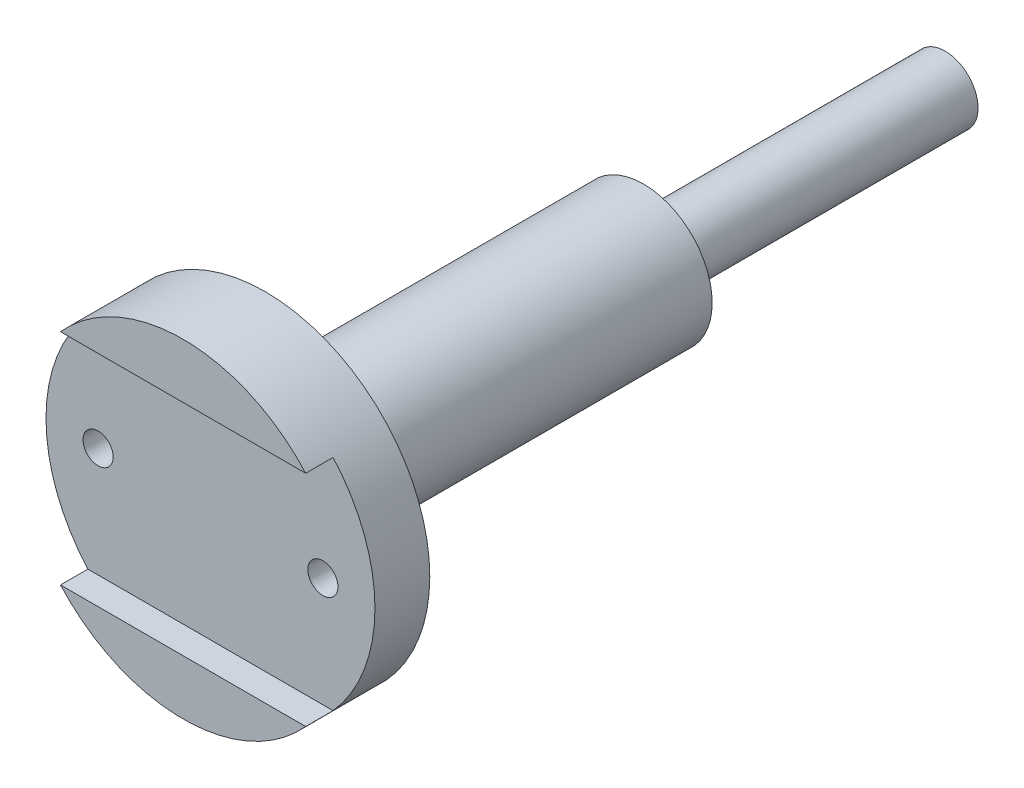
ISO-10303-21;
HEADER;
FILE_DESCRIPTION(('STEP AP214'),'2;1');
FILE_NAME('part.step','',(''),(''),'','','');
FILE_SCHEMA(('AUTOMOTIVE_DESIGN { 1 0 10303 214 1 1 1 1 }'));
ENDSEC;
DATA;
#1=APPLICATION_CONTEXT('core data for automotive mechanical design processes');
#2=APPLICATION_PROTOCOL_DEFINITION('international standard','automotive_design',2000,#1);
#3=PRODUCT_CONTEXT('',#1,'mechanical');
#4=PRODUCT('Part','Part','',(#3));
#5=PRODUCT_RELATED_PRODUCT_CATEGORY('part','',(#4));
#6=PRODUCT_DEFINITION_FORMATION('','',#4);
#7=PRODUCT_DEFINITION_CONTEXT('part definition',#1,'design');
#8=PRODUCT_DEFINITION('design','',#6,#7);
#9=PRODUCT_DEFINITION_SHAPE('','',#8);
#10=(LENGTH_UNIT() NAMED_UNIT(*) SI_UNIT(.MILLI.,.METRE.));
#11=(NAMED_UNIT(*) PLANE_ANGLE_UNIT() SI_UNIT($,.RADIAN.));
#12=(NAMED_UNIT(*) SI_UNIT($,.STERADIAN.) SOLID_ANGLE_UNIT());
#13=UNCERTAINTY_MEASURE_WITH_UNIT(LENGTH_MEASURE(1.E-05),#10,'distance_accuracy_value','');
#14=(GEOMETRIC_REPRESENTATION_CONTEXT(3) GLOBAL_UNCERTAINTY_ASSIGNED_CONTEXT((#13)) GLOBAL_UNIT_ASSIGNED_CONTEXT((#10,
#11,#12)) REPRESENTATION_CONTEXT('',''));
#15=CARTESIAN_POINT('',(0.,0.,0.));
#16=DIRECTION('',(0.,0.,1.));
#17=DIRECTION('',(1.,0.,0.));
#18=AXIS2_PLACEMENT_3D('',#15,#16,#17);
#19=CARTESIAN_POINT('',(0.,0.,0.));
#20=DIRECTION('',(0.,0.,1.));
#21=DIRECTION('',(1.,0.,0.));
#22=AXIS2_PLACEMENT_3D('',#19,#20,#21);
#23=PLANE('',#22);
#24=CARTESIAN_POINT('',(20.5,0.,0.));
#25=DIRECTION('',(0.,0.,-1.));
#26=DIRECTION('',(-1.,0.,0.));
#27=AXIS2_PLACEMENT_3D('',#24,#25,#26);
#28=CIRCLE('',#27,6.12);
#29=CARTESIAN_POINT('',(14.38,0.,0.));
#30=VERTEX_POINT('',#29);
#31=EDGE_CURVE('E166',#30,#30,#28,.T.);
#32=ORIENTED_EDGE('',*,*,#31,.F.);
#33=EDGE_LOOP('',(#32));
#34=FACE_BOUND('',#33,.T.);
#35=CARTESIAN_POINT('',(0.,0.,0.));
#36=DIRECTION('',(0.,0.,1.));
#37=DIRECTION('',(1.,0.,0.));
#38=AXIS2_PLACEMENT_3D('',#35,#36,#37);
#39=CIRCLE('',#38,12.5);
#40=CARTESIAN_POINT('',(12.5,0.,0.));
#41=VERTEX_POINT('',#40);
#42=EDGE_CURVE('E86',#41,#41,#39,.F.);
#43=ORIENTED_EDGE('',*,*,#42,.F.);
#44=EDGE_LOOP('',(#43));
#45=FACE_BOUND('',#44,.T.);
#46=CARTESIAN_POINT('',(0.,0.,0.));
#47=DIRECTION('',(0.,0.,1.));
#48=DIRECTION('',(1.,0.,0.));
#49=AXIS2_PLACEMENT_3D('',#46,#47,#48);
#50=CIRCLE('',#49,30.);
#51=CARTESIAN_POINT('',(30.,0.,0.));
#52=VERTEX_POINT('',#51);
#53=EDGE_CURVE('E97',#52,#52,#50,.T.);
#54=ORIENTED_EDGE('',*,*,#53,.F.);
#55=EDGE_LOOP('',(#54));
#56=FACE_BOUND('',#55,.T.);
#57=CARTESIAN_POINT('',(-20.5,0.,0.));
#58=DIRECTION('',(0.,0.,-1.));
#59=DIRECTION('',(-1.,0.,0.));
#60=AXIS2_PLACEMENT_3D('',#57,#58,#59);
#61=CIRCLE('',#60,6.12);
#62=CARTESIAN_POINT('',(-26.62,0.,0.));
#63=VERTEX_POINT('',#62);
#64=EDGE_CURVE('E148',#63,#63,#61,.T.);
#65=ORIENTED_EDGE('',*,*,#64,.F.);
#66=EDGE_LOOP('',(#65));
#67=FACE_BOUND('',#66,.T.);
#68=ADVANCED_FACE('F35',(#34,#45,#56,#67),#23,.F.);
#69=CARTESIAN_POINT('',(0.,0.,15.));
#70=DIRECTION('',(0.,0.,1.));
#71=DIRECTION('',(1.,0.,0.));
#72=AXIS2_PLACEMENT_3D('',#69,#70,#71);
#73=PLANE('',#72);
#74=DIRECTION('',(-1.,0.,0.));
#75=VECTOR('',#74,1.);
#76=CARTESIAN_POINT('',(0.,20.,15.));
#77=LINE('',#76,#75);
#78=CARTESIAN_POINT('',(22.3606797749979,20.,15.));
#79=VERTEX_POINT('',#78);
#80=CARTESIAN_POINT('',(-22.3606797749979,20.,15.));
#81=VERTEX_POINT('',#80);
#82=EDGE_CURVE('E85',#79,#81,#77,.T.);
#83=ORIENTED_EDGE('',*,*,#82,.F.);
#84=CARTESIAN_POINT('',(0.,0.,15.));
#85=DIRECTION('',(0.,0.,1.));
#86=DIRECTION('',(1.,0.,0.));
#87=AXIS2_PLACEMENT_3D('',#84,#85,#86);
#88=CIRCLE('',#87,30.);
#89=EDGE_CURVE('E96',#79,#81,#88,.T.);
#90=ORIENTED_EDGE('',*,*,#89,.T.);
#91=EDGE_LOOP('',(#83,#90));
#92=FACE_BOUND('',#91,.T.);
#93=ADVANCED_FACE('F142',(#92),#73,.T.);
#94=CARTESIAN_POINT('',(0.,0.,15.));
#95=DIRECTION('',(0.,0.,-1.));
#96=DIRECTION('',(-1.,0.,0.));
#97=AXIS2_PLACEMENT_3D('',#94,#95,#96);
#98=CYLINDRICAL_SURFACE('',#97,30.);
#99=ORIENTED_EDGE('',*,*,#89,.F.);
#100=DIRECTION('',(0.,0.,-1.));
#101=VECTOR('',#100,1.);
#102=CARTESIAN_POINT('',(22.3606797749979,20.,15.));
#103=LINE('',#102,#101);
#104=CARTESIAN_POINT('',(22.3606797749979,20.,10.));
#105=VERTEX_POINT('',#104);
#106=EDGE_CURVE('E128',#79,#105,#103,.T.);
#107=ORIENTED_EDGE('',*,*,#106,.T.);
#108=CARTESIAN_POINT('',(0.,0.,10.));
#109=DIRECTION('',(0.,0.,-1.));
#110=DIRECTION('',(-1.,0.,0.));
#111=AXIS2_PLACEMENT_3D('',#108,#109,#110);
#112=CIRCLE('',#111,30.);
#113=CARTESIAN_POINT('',(22.3606797749979,-20.,10.));
#114=VERTEX_POINT('',#113);
#115=EDGE_CURVE('E11',#105,#114,#112,.T.);
#116=ORIENTED_EDGE('',*,*,#115,.T.);
#117=DIRECTION('',(0.,0.,-1.));
#118=VECTOR('',#117,1.);
#119=CARTESIAN_POINT('',(22.3606797749979,-20.,15.));
#120=LINE('',#119,#118);
#121=CARTESIAN_POINT('',(22.3606797749979,-20.,15.));
#122=VERTEX_POINT('',#121);
#123=EDGE_CURVE('E80',#114,#122,#120,.F.);
#124=ORIENTED_EDGE('',*,*,#123,.T.);
#125=CARTESIAN_POINT('',(-22.3606797749979,-20.,15.));
#126=VERTEX_POINT('',#125);
#127=EDGE_CURVE('E91',#126,#122,#88,.T.);
#128=ORIENTED_EDGE('',*,*,#127,.F.);
#129=DIRECTION('',(0.,0.,-1.));
#130=VECTOR('',#129,1.);
#131=CARTESIAN_POINT('',(-22.3606797749979,-20.,15.));
#132=LINE('',#131,#130);
#133=CARTESIAN_POINT('',(-22.3606797749979,-20.,10.));
#134=VERTEX_POINT('',#133);
#135=EDGE_CURVE('E52',#126,#134,#132,.T.);
#136=ORIENTED_EDGE('',*,*,#135,.T.);
#137=CARTESIAN_POINT('',(-22.3606797749979,20.,10.));
#138=VERTEX_POINT('',#137);
#139=EDGE_CURVE('E44',#134,#138,#112,.T.);
#140=ORIENTED_EDGE('',*,*,#139,.T.);
#141=DIRECTION('',(0.,0.,-1.));
#142=VECTOR('',#141,1.);
#143=CARTESIAN_POINT('',(-22.3606797749979,20.,15.));
#144=LINE('',#143,#142);
#145=EDGE_CURVE('E60',#138,#81,#144,.F.);
#146=ORIENTED_EDGE('',*,*,#145,.T.);
#147=EDGE_LOOP('',(#99,#107,#116,#124,#128,#136,#140,#146));
#148=FACE_BOUND('',#147,.T.);
#149=ORIENTED_EDGE('',*,*,#53,.T.);
#150=EDGE_LOOP('',(#149));
#151=FACE_BOUND('',#150,.T.);
#152=ADVANCED_FACE('F37',(#148,#151),#98,.T.);
#153=DIRECTION('',(1.,0.,0.));
#154=VECTOR('',#153,1.);
#155=CARTESIAN_POINT('',(0.,-20.,15.));
#156=LINE('',#155,#154);
#157=EDGE_CURVE('E77',#126,#122,#156,.T.);
#158=ORIENTED_EDGE('',*,*,#157,.F.);
#159=ORIENTED_EDGE('',*,*,#127,.T.);
#160=EDGE_LOOP('',(#158,#159));
#161=FACE_BOUND('',#160,.T.);
#162=ADVANCED_FACE('F95',(#161),#73,.T.);
#163=CARTESIAN_POINT('',(0.,0.,-69.));
#164=DIRECTION('',(0.,0.,1.));
#165=DIRECTION('',(1.,0.,0.));
#166=AXIS2_PLACEMENT_3D('',#163,#164,#165);
#167=CYLINDRICAL_SURFACE('',#166,12.5);
#168=CARTESIAN_POINT('',(0.,0.,-69.));
#169=DIRECTION('',(0.,0.,-1.));
#170=DIRECTION('',(-1.,0.,0.));
#171=AXIS2_PLACEMENT_3D('',#168,#169,#170);
#172=CIRCLE('',#171,12.5);
#173=CARTESIAN_POINT('',(-12.5,0.,-69.));
#174=VERTEX_POINT('',#173);
#175=EDGE_CURVE('E101',#174,#174,#172,.T.);
#176=ORIENTED_EDGE('',*,*,#175,.F.);
#177=EDGE_LOOP('',(#176));
#178=FACE_BOUND('',#177,.T.);
#179=ORIENTED_EDGE('',*,*,#42,.T.);
#180=EDGE_LOOP('',(#179));
#181=FACE_BOUND('',#180,.T.);
#182=ADVANCED_FACE('F134',(#178,#181),#167,.T.);
#183=CARTESIAN_POINT('',(0.,0.,-69.));
#184=DIRECTION('',(0.,0.,-1.));
#185=DIRECTION('',(-1.,0.,0.));
#186=AXIS2_PLACEMENT_3D('',#183,#184,#185);
#187=PLANE('',#186);
#188=CARTESIAN_POINT('',(0.,0.,-69.));
#189=DIRECTION('',(0.,0.,-1.));
#190=DIRECTION('',(-1.,0.,0.));
#191=AXIS2_PLACEMENT_3D('',#188,#189,#190);
#192=CIRCLE('',#191,6.);
#193=CARTESIAN_POINT('',(-6.,0.,-69.));
#194=VERTEX_POINT('',#193);
#195=EDGE_CURVE('E157',#194,#194,#192,.T.);
#196=ORIENTED_EDGE('',*,*,#195,.F.);
#197=EDGE_LOOP('',(#196));
#198=FACE_BOUND('',#197,.T.);
#199=ORIENTED_EDGE('',*,*,#175,.T.);
#200=EDGE_LOOP('',(#199));
#201=FACE_BOUND('',#200,.T.);
#202=ADVANCED_FACE('F132',(#198,#201),#187,.T.);
#203=CARTESIAN_POINT('',(0.,0.,10.));
#204=DIRECTION('',(0.,0.,-1.));
#205=DIRECTION('',(-1.,0.,0.));
#206=AXIS2_PLACEMENT_3D('',#203,#204,#205);
#207=PLANE('',#206);
#208=CARTESIAN_POINT('',(-20.5,0.,10.));
#209=DIRECTION('',(0.,0.,-1.));
#210=DIRECTION('',(-1.,0.,0.));
#211=AXIS2_PLACEMENT_3D('',#208,#209,#210);
#212=CIRCLE('',#211,2.75);
#213=CARTESIAN_POINT('',(-23.25,0.,10.));
#214=VERTEX_POINT('',#213);
#215=EDGE_CURVE('E39',#214,#214,#212,.T.);
#216=ORIENTED_EDGE('',*,*,#215,.T.);
#217=EDGE_LOOP('',(#216));
#218=FACE_BOUND('',#217,.T.);
#219=CARTESIAN_POINT('',(20.5,0.,10.));
#220=DIRECTION('',(0.,0.,-1.));
#221=DIRECTION('',(-1.,0.,0.));
#222=AXIS2_PLACEMENT_3D('',#219,#220,#221);
#223=CIRCLE('',#222,2.75);
#224=CARTESIAN_POINT('',(17.75,0.,10.));
#225=VERTEX_POINT('',#224);
#226=EDGE_CURVE('E109',#225,#225,#223,.T.);
#227=ORIENTED_EDGE('',*,*,#226,.T.);
#228=EDGE_LOOP('',(#227));
#229=FACE_BOUND('',#228,.T.);
#230=DIRECTION('',(-1.,0.,0.));
#231=VECTOR('',#230,1.);
#232=CARTESIAN_POINT('',(115.,20.,10.));
#233=LINE('',#232,#231);
#234=EDGE_CURVE('E93',#105,#138,#233,.T.);
#235=ORIENTED_EDGE('',*,*,#234,.T.);
#236=ORIENTED_EDGE('',*,*,#139,.F.);
#237=DIRECTION('',(1.,0.,0.));
#238=VECTOR('',#237,1.);
#239=CARTESIAN_POINT('',(115.,-20.,10.));
#240=LINE('',#239,#238);
#241=EDGE_CURVE('E111',#134,#114,#240,.T.);
#242=ORIENTED_EDGE('',*,*,#241,.T.);
#243=ORIENTED_EDGE('',*,*,#115,.F.);
#244=EDGE_LOOP('',(#235,#236,#242,#243));
#245=FACE_BOUND('',#244,.T.);
#246=ADVANCED_FACE('F197',(#218,#229,#245),#207,.F.);
#247=CARTESIAN_POINT('',(115.,20.,10.));
#248=DIRECTION('',(0.,1.,0.));
#249=DIRECTION('',(-1.,0.,0.));
#250=AXIS2_PLACEMENT_3D('',#247,#248,#249);
#251=PLANE('',#250);
#252=ORIENTED_EDGE('',*,*,#82,.T.);
#253=ORIENTED_EDGE('',*,*,#145,.F.);
#254=ORIENTED_EDGE('',*,*,#234,.F.);
#255=ORIENTED_EDGE('',*,*,#106,.F.);
#256=EDGE_LOOP('',(#252,#253,#254,#255));
#257=FACE_BOUND('',#256,.T.);
#258=ADVANCED_FACE('F200',(#257),#251,.F.);
#259=CARTESIAN_POINT('',(115.,-20.,10.));
#260=DIRECTION('',(0.,-1.,0.));
#261=DIRECTION('',(1.,0.,0.));
#262=AXIS2_PLACEMENT_3D('',#259,#260,#261);
#263=PLANE('',#262);
#264=ORIENTED_EDGE('',*,*,#157,.T.);
#265=ORIENTED_EDGE('',*,*,#123,.F.);
#266=ORIENTED_EDGE('',*,*,#241,.F.);
#267=ORIENTED_EDGE('',*,*,#135,.F.);
#268=EDGE_LOOP('',(#264,#265,#266,#267));
#269=FACE_BOUND('',#268,.T.);
#270=ADVANCED_FACE('F79',(#269),#263,.F.);
#271=CARTESIAN_POINT('',(20.5,0.,0.));
#272=DIRECTION('',(0.,0.,-1.));
#273=DIRECTION('',(-1.,0.,0.));
#274=AXIS2_PLACEMENT_3D('',#271,#272,#273);
#275=CYLINDRICAL_SURFACE('',#274,2.75);
#276=CARTESIAN_POINT('',(20.5,0.,3.60500000000001));
#277=DIRECTION('',(0.,0.,-1.));
#278=DIRECTION('',(-1.,0.,0.));
#279=AXIS2_PLACEMENT_3D('',#276,#277,#278);
#280=CIRCLE('',#279,2.75);
#281=CARTESIAN_POINT('',(17.75,0.,3.60500000000001));
#282=VERTEX_POINT('',#281);
#283=EDGE_CURVE('E112',#282,#282,#280,.T.);
#284=ORIENTED_EDGE('',*,*,#283,.T.);
#285=EDGE_LOOP('',(#284));
#286=FACE_BOUND('',#285,.T.);
#287=ORIENTED_EDGE('',*,*,#226,.F.);
#288=EDGE_LOOP('',(#287));
#289=FACE_BOUND('',#288,.T.);
#290=ADVANCED_FACE('F193',(#286,#289),#275,.F.);
#291=CARTESIAN_POINT('',(20.5,0.,3.58));
#292=DIRECTION('',(0.,0.,-1.));
#293=DIRECTION('',(-1.,0.,0.));
#294=AXIS2_PLACEMENT_3D('',#291,#292,#293);
#295=CONICAL_SURFACE('',#294,2.775,0.785398163397292);
#296=ORIENTED_EDGE('',*,*,#283,.F.);
#297=EDGE_LOOP('',(#296));
#298=FACE_BOUND('',#297,.T.);
#299=CARTESIAN_POINT('',(20.5,0.,3.58));
#300=DIRECTION('',(0.,0.,-1.));
#301=DIRECTION('',(-1.,0.,0.));
#302=AXIS2_PLACEMENT_3D('',#299,#300,#301);
#303=CIRCLE('',#302,2.775);
#304=CARTESIAN_POINT('',(17.725,0.,3.58));
#305=VERTEX_POINT('',#304);
#306=EDGE_CURVE('E117',#305,#305,#303,.T.);
#307=ORIENTED_EDGE('',*,*,#306,.T.);
#308=EDGE_LOOP('',(#307));
#309=FACE_BOUND('',#308,.T.);
#310=ADVANCED_FACE('F186',(#298,#309),#295,.F.);
#311=CARTESIAN_POINT('',(23.275,0.,3.58));
#312=DIRECTION('',(0.,0.,1.));
#313=DIRECTION('',(1.,0.,0.));
#314=AXIS2_PLACEMENT_3D('',#311,#312,#313);
#315=PLANE('',#314);
#316=ORIENTED_EDGE('',*,*,#306,.F.);
#317=EDGE_LOOP('',(#316));
#318=FACE_BOUND('',#317,.T.);
#319=CARTESIAN_POINT('',(20.5,0.,3.58));
#320=DIRECTION('',(0.,0.,-1.));
#321=DIRECTION('',(-1.,0.,0.));
#322=AXIS2_PLACEMENT_3D('',#319,#320,#321);
#323=CIRCLE('',#322,6.12);
#324=CARTESIAN_POINT('',(14.38,0.,3.58));
#325=VERTEX_POINT('',#324);
#326=EDGE_CURVE('E122',#325,#325,#323,.T.);
#327=ORIENTED_EDGE('',*,*,#326,.T.);
#328=EDGE_LOOP('',(#327));
#329=FACE_BOUND('',#328,.T.);
#330=ADVANCED_FACE('F171',(#318,#329),#315,.F.);
#331=CARTESIAN_POINT('',(20.5,0.,0.));
#332=DIRECTION('',(0.,0.,-1.));
#333=DIRECTION('',(-1.,0.,0.));
#334=AXIS2_PLACEMENT_3D('',#331,#332,#333);
#335=CYLINDRICAL_SURFACE('',#334,6.12);
#336=ORIENTED_EDGE('',*,*,#326,.F.);
#337=EDGE_LOOP('',(#336));
#338=FACE_BOUND('',#337,.T.);
#339=ORIENTED_EDGE('',*,*,#31,.T.);
#340=EDGE_LOOP('',(#339));
#341=FACE_BOUND('',#340,.T.);
#342=ADVANCED_FACE('F173',(#338,#341),#335,.F.);
#343=CARTESIAN_POINT('',(-20.5,0.,0.));
#344=DIRECTION('',(0.,0.,-1.));
#345=DIRECTION('',(-1.,0.,0.));
#346=AXIS2_PLACEMENT_3D('',#343,#344,#345);
#347=CYLINDRICAL_SURFACE('',#346,2.75);
#348=CARTESIAN_POINT('',(-20.5,0.,3.60500000000001));
#349=DIRECTION('',(0.,0.,-1.));
#350=DIRECTION('',(-1.,0.,0.));
#351=AXIS2_PLACEMENT_3D('',#348,#349,#350);
#352=CIRCLE('',#351,2.75);
#353=CARTESIAN_POINT('',(-23.25,0.,3.60500000000001));
#354=VERTEX_POINT('',#353);
#355=EDGE_CURVE('E163',#354,#354,#352,.T.);
#356=ORIENTED_EDGE('',*,*,#355,.T.);
#357=EDGE_LOOP('',(#356));
#358=FACE_BOUND('',#357,.T.);
#359=ORIENTED_EDGE('',*,*,#215,.F.);
#360=EDGE_LOOP('',(#359));
#361=FACE_BOUND('',#360,.T.);
#362=ADVANCED_FACE('F176',(#358,#361),#347,.F.);
#363=CARTESIAN_POINT('',(-20.5,0.,3.58));
#364=DIRECTION('',(0.,0.,-1.));
#365=DIRECTION('',(-1.,0.,0.));
#366=AXIS2_PLACEMENT_3D('',#363,#364,#365);
#367=CONICAL_SURFACE('',#366,2.775,0.785398163397292);
#368=ORIENTED_EDGE('',*,*,#355,.F.);
#369=EDGE_LOOP('',(#368));
#370=FACE_BOUND('',#369,.T.);
#371=CARTESIAN_POINT('',(-20.5,0.,3.58));
#372=DIRECTION('',(0.,0.,-1.));
#373=DIRECTION('',(-1.,0.,0.));
#374=AXIS2_PLACEMENT_3D('',#371,#372,#373);
#375=CIRCLE('',#374,2.775);
#376=CARTESIAN_POINT('',(-23.275,0.,3.58));
#377=VERTEX_POINT('',#376);
#378=EDGE_CURVE('E154',#377,#377,#375,.T.);
#379=ORIENTED_EDGE('',*,*,#378,.T.);
#380=EDGE_LOOP('',(#379));
#381=FACE_BOUND('',#380,.T.);
#382=ADVANCED_FACE('F183',(#370,#381),#367,.F.);
#383=CARTESIAN_POINT('',(-17.725,0.,3.58));
#384=DIRECTION('',(0.,0.,1.));
#385=DIRECTION('',(1.,0.,0.));
#386=AXIS2_PLACEMENT_3D('',#383,#384,#385);
#387=PLANE('',#386);
#388=ORIENTED_EDGE('',*,*,#378,.F.);
#389=EDGE_LOOP('',(#388));
#390=FACE_BOUND('',#389,.T.);
#391=CARTESIAN_POINT('',(-20.5,0.,3.58));
#392=DIRECTION('',(0.,0.,-1.));
#393=DIRECTION('',(-1.,0.,0.));
#394=AXIS2_PLACEMENT_3D('',#391,#392,#393);
#395=CIRCLE('',#394,6.12);
#396=CARTESIAN_POINT('',(-26.62,0.,3.58));
#397=VERTEX_POINT('',#396);
#398=EDGE_CURVE('E150',#397,#397,#395,.T.);
#399=ORIENTED_EDGE('',*,*,#398,.T.);
#400=EDGE_LOOP('',(#399));
#401=FACE_BOUND('',#400,.T.);
#402=ADVANCED_FACE('F290',(#390,#401),#387,.F.);
#403=CARTESIAN_POINT('',(-20.5,0.,0.));
#404=DIRECTION('',(0.,0.,-1.));
#405=DIRECTION('',(-1.,0.,0.));
#406=AXIS2_PLACEMENT_3D('',#403,#404,#405);
#407=CYLINDRICAL_SURFACE('',#406,6.12);
#408=ORIENTED_EDGE('',*,*,#398,.F.);
#409=EDGE_LOOP('',(#408));
#410=FACE_BOUND('',#409,.T.);
#411=ORIENTED_EDGE('',*,*,#64,.T.);
#412=EDGE_LOOP('',(#411));
#413=FACE_BOUND('',#412,.T.);
#414=ADVANCED_FACE('F299',(#410,#413),#407,.F.);
#415=CARTESIAN_POINT('',(0.,0.,-124.));
#416=DIRECTION('',(0.,0.,1.));
#417=DIRECTION('',(1.,0.,0.));
#418=AXIS2_PLACEMENT_3D('',#415,#416,#417);
#419=CYLINDRICAL_SURFACE('',#418,6.);
#420=CARTESIAN_POINT('',(0.,0.,-124.));
#421=DIRECTION('',(0.,0.,-1.));
#422=DIRECTION('',(-1.,0.,0.));
#423=AXIS2_PLACEMENT_3D('',#420,#421,#422);
#424=CIRCLE('',#423,6.);
#425=CARTESIAN_POINT('',(-6.,0.,-124.));
#426=VERTEX_POINT('',#425);
#427=EDGE_CURVE('E151',#426,#426,#424,.T.);
#428=ORIENTED_EDGE('',*,*,#427,.F.);
#429=EDGE_LOOP('',(#428));
#430=FACE_BOUND('',#429,.T.);
#431=ORIENTED_EDGE('',*,*,#195,.T.);
#432=EDGE_LOOP('',(#431));
#433=FACE_BOUND('',#432,.T.);
#434=ADVANCED_FACE('F309',(#430,#433),#419,.T.);
#435=CARTESIAN_POINT('',(0.,0.,-124.));
#436=DIRECTION('',(0.,0.,-1.));
#437=DIRECTION('',(-1.,0.,0.));
#438=AXIS2_PLACEMENT_3D('',#435,#436,#437);
#439=PLANE('',#438);
#440=ORIENTED_EDGE('',*,*,#427,.T.);
#441=EDGE_LOOP('',(#440));
#442=FACE_BOUND('',#441,.T.);
#443=ADVANCED_FACE('F325',(#442),#439,.T.);
#444=CLOSED_SHELL('',(#68,#93,#152,#162,#182,#202,#246,#258,#270,#290,#310,#330,#342,#362,#382,
#402,#414,#434,#443));
#445=MANIFOLD_SOLID_BREP('B2',#444);
#446=ADVANCED_BREP_SHAPE_REPRESENTATION('',(#18,#445),#14);
#447=SHAPE_DEFINITION_REPRESENTATION(#9,#446);
ENDSEC;
END-ISO-10303-21;
